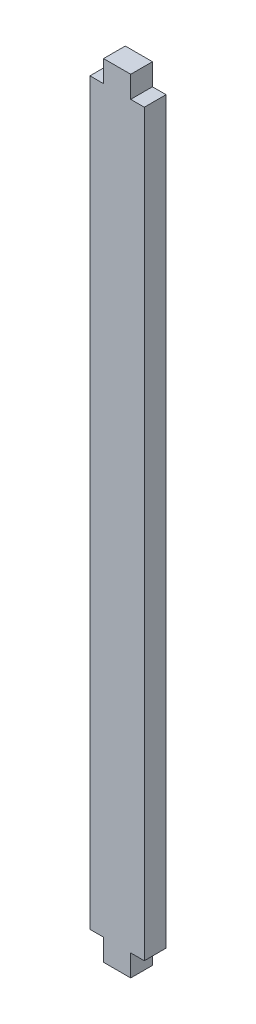
ISO-10303-21;
HEADER;
FILE_DESCRIPTION(('STEP AP214'),'2;1');
FILE_NAME('part.step','',(''),(''),'','','');
FILE_SCHEMA(('AUTOMOTIVE_DESIGN { 1 0 10303 214 1 1 1 1 }'));
ENDSEC;
DATA;
#1=APPLICATION_CONTEXT('core data for automotive mechanical design processes');
#2=APPLICATION_PROTOCOL_DEFINITION('international standard','automotive_design',2000,#1);
#3=PRODUCT_CONTEXT('',#1,'mechanical');
#4=PRODUCT('Part','Part','',(#3));
#5=PRODUCT_RELATED_PRODUCT_CATEGORY('part','',(#4));
#6=PRODUCT_DEFINITION_FORMATION('','',#4);
#7=PRODUCT_DEFINITION_CONTEXT('part definition',#1,'design');
#8=PRODUCT_DEFINITION('design','',#6,#7);
#9=PRODUCT_DEFINITION_SHAPE('','',#8);
#10=(LENGTH_UNIT() NAMED_UNIT(*) SI_UNIT(.MILLI.,.METRE.));
#11=(NAMED_UNIT(*) PLANE_ANGLE_UNIT() SI_UNIT($,.RADIAN.));
#12=(NAMED_UNIT(*) SI_UNIT($,.STERADIAN.) SOLID_ANGLE_UNIT());
#13=UNCERTAINTY_MEASURE_WITH_UNIT(LENGTH_MEASURE(1.E-05),#10,'distance_accuracy_value','');
#14=(GEOMETRIC_REPRESENTATION_CONTEXT(3) GLOBAL_UNCERTAINTY_ASSIGNED_CONTEXT((#13)) GLOBAL_UNIT_ASSIGNED_CONTEXT((#10,
#11,#12)) REPRESENTATION_CONTEXT('',''));
#15=CARTESIAN_POINT('',(0.,0.,0.));
#16=DIRECTION('',(0.,0.,1.));
#17=DIRECTION('',(1.,0.,0.));
#18=AXIS2_PLACEMENT_3D('',#15,#16,#17);
#19=CARTESIAN_POINT('',(0.,0.,5.08));
#20=DIRECTION('',(1.,0.,0.));
#21=DIRECTION('',(0.,0.,-1.));
#22=AXIS2_PLACEMENT_3D('',#19,#20,#21);
#23=PLANE('',#22);
#24=DIRECTION('',(0.,-1.,0.));
#25=VECTOR('',#24,1.);
#26=CARTESIAN_POINT('',(0.,0.,0.));
#27=LINE('',#26,#25);
#28=CARTESIAN_POINT('',(0.,177.8,0.));
#29=VERTEX_POINT('',#28);
#30=CARTESIAN_POINT('',(0.,5.08,0.));
#31=VERTEX_POINT('',#30);
#32=EDGE_CURVE('E149',#29,#31,#27,.T.);
#33=ORIENTED_EDGE('',*,*,#32,.T.);
#34=DIRECTION('',(0.,0.,1.));
#35=VECTOR('',#34,1.);
#36=CARTESIAN_POINT('',(0.,5.08,0.));
#37=LINE('',#36,#35);
#38=CARTESIAN_POINT('',(0.,5.08,5.08));
#39=VERTEX_POINT('',#38);
#40=EDGE_CURVE('E183',#31,#39,#37,.T.);
#41=ORIENTED_EDGE('',*,*,#40,.T.);
#42=DIRECTION('',(0.,-1.,0.));
#43=VECTOR('',#42,1.);
#44=CARTESIAN_POINT('',(0.,0.,5.08));
#45=LINE('',#44,#43);
#46=CARTESIAN_POINT('',(0.,177.8,5.08));
#47=VERTEX_POINT('',#46);
#48=EDGE_CURVE('E147',#47,#39,#45,.T.);
#49=ORIENTED_EDGE('',*,*,#48,.F.);
#50=DIRECTION('',(0.,0.,1.));
#51=VECTOR('',#50,1.);
#52=CARTESIAN_POINT('',(0.,177.8,0.));
#53=LINE('',#52,#51);
#54=EDGE_CURVE('E161',#29,#47,#53,.T.);
#55=ORIENTED_EDGE('',*,*,#54,.F.);
#56=EDGE_LOOP('',(#33,#41,#49,#55));
#57=FACE_BOUND('',#56,.T.);
#58=ADVANCED_FACE('F32',(#57),#23,.F.);
#59=CARTESIAN_POINT('',(0.,0.,5.08));
#60=DIRECTION('',(0.,1.,0.));
#61=DIRECTION('',(0.,0.,1.));
#62=AXIS2_PLACEMENT_3D('',#59,#60,#61);
#63=PLANE('',#62);
#64=DIRECTION('',(1.,0.,0.));
#65=VECTOR('',#64,1.);
#66=CARTESIAN_POINT('',(0.,0.,5.08));
#67=LINE('',#66,#65);
#68=CARTESIAN_POINT('',(3.175,0.,5.08));
#69=VERTEX_POINT('',#68);
#70=CARTESIAN_POINT('',(9.525,0.,5.08));
#71=VERTEX_POINT('',#70);
#72=EDGE_CURVE('E156',#69,#71,#67,.T.);
#73=ORIENTED_EDGE('',*,*,#72,.F.);
#74=DIRECTION('',(0.,0.,1.));
#75=VECTOR('',#74,1.);
#76=CARTESIAN_POINT('',(3.175,0.,0.));
#77=LINE('',#76,#75);
#78=CARTESIAN_POINT('',(3.175,0.,0.));
#79=VERTEX_POINT('',#78);
#80=EDGE_CURVE('E179',#79,#69,#77,.T.);
#81=ORIENTED_EDGE('',*,*,#80,.F.);
#82=DIRECTION('',(1.,0.,0.));
#83=VECTOR('',#82,1.);
#84=CARTESIAN_POINT('',(0.,0.,0.));
#85=LINE('',#84,#83);
#86=CARTESIAN_POINT('',(9.525,0.,0.));
#87=VERTEX_POINT('',#86);
#88=EDGE_CURVE('E145',#79,#87,#85,.T.);
#89=ORIENTED_EDGE('',*,*,#88,.T.);
#90=DIRECTION('',(0.,0.,1.));
#91=VECTOR('',#90,1.);
#92=CARTESIAN_POINT('',(9.525,0.,0.));
#93=LINE('',#92,#91);
#94=EDGE_CURVE('E193',#87,#71,#93,.T.);
#95=ORIENTED_EDGE('',*,*,#94,.T.);
#96=EDGE_LOOP('',(#73,#81,#89,#95));
#97=FACE_BOUND('',#96,.T.);
#98=ADVANCED_FACE('F220',(#97),#63,.F.);
#99=CARTESIAN_POINT('',(12.7,0.,5.08));
#100=DIRECTION('',(-1.,0.,0.));
#101=DIRECTION('',(0.,0.,1.));
#102=AXIS2_PLACEMENT_3D('',#99,#100,#101);
#103=PLANE('',#102);
#104=DIRECTION('',(0.,1.,0.));
#105=VECTOR('',#104,1.);
#106=CARTESIAN_POINT('',(12.7,0.,0.));
#107=LINE('',#106,#105);
#108=CARTESIAN_POINT('',(12.7,5.08,0.));
#109=VERTEX_POINT('',#108);
#110=CARTESIAN_POINT('',(12.7,177.8,0.));
#111=VERTEX_POINT('',#110);
#112=EDGE_CURVE('E140',#109,#111,#107,.T.);
#113=ORIENTED_EDGE('',*,*,#112,.T.);
#114=DIRECTION('',(0.,0.,1.));
#115=VECTOR('',#114,1.);
#116=CARTESIAN_POINT('',(12.7,177.8,0.));
#117=LINE('',#116,#115);
#118=CARTESIAN_POINT('',(12.7,177.8,5.08));
#119=VERTEX_POINT('',#118);
#120=EDGE_CURVE('E174',#111,#119,#117,.T.);
#121=ORIENTED_EDGE('',*,*,#120,.T.);
#122=DIRECTION('',(0.,1.,0.));
#123=VECTOR('',#122,1.);
#124=CARTESIAN_POINT('',(12.7,0.,5.08));
#125=LINE('',#124,#123);
#126=CARTESIAN_POINT('',(12.7,5.08,5.08));
#127=VERTEX_POINT('',#126);
#128=EDGE_CURVE('E40',#127,#119,#125,.T.);
#129=ORIENTED_EDGE('',*,*,#128,.F.);
#130=DIRECTION('',(0.,0.,1.));
#131=VECTOR('',#130,1.);
#132=CARTESIAN_POINT('',(12.7,5.08,0.));
#133=LINE('',#132,#131);
#134=EDGE_CURVE('E126',#109,#127,#133,.T.);
#135=ORIENTED_EDGE('',*,*,#134,.F.);
#136=EDGE_LOOP('',(#113,#121,#129,#135));
#137=FACE_BOUND('',#136,.T.);
#138=ADVANCED_FACE('F138',(#137),#103,.F.);
#139=CARTESIAN_POINT('',(0.,182.88,5.08));
#140=DIRECTION('',(0.,-1.,0.));
#141=DIRECTION('',(0.,0.,-1.));
#142=AXIS2_PLACEMENT_3D('',#139,#140,#141);
#143=PLANE('',#142);
#144=DIRECTION('',(-1.,0.,0.));
#145=VECTOR('',#144,1.);
#146=CARTESIAN_POINT('',(0.,182.88,5.08));
#147=LINE('',#146,#145);
#148=CARTESIAN_POINT('',(9.52500000000003,182.88,5.08));
#149=VERTEX_POINT('',#148);
#150=CARTESIAN_POINT('',(3.175,182.88,5.08));
#151=VERTEX_POINT('',#150);
#152=EDGE_CURVE('E11',#149,#151,#147,.T.);
#153=ORIENTED_EDGE('',*,*,#152,.F.);
#154=DIRECTION('',(0.,0.,1.));
#155=VECTOR('',#154,1.);
#156=CARTESIAN_POINT('',(9.52500000000003,182.88,0.));
#157=LINE('',#156,#155);
#158=CARTESIAN_POINT('',(9.52500000000003,182.88,0.));
#159=VERTEX_POINT('',#158);
#160=EDGE_CURVE('E197',#159,#149,#157,.T.);
#161=ORIENTED_EDGE('',*,*,#160,.F.);
#162=DIRECTION('',(-1.,0.,0.));
#163=VECTOR('',#162,1.);
#164=CARTESIAN_POINT('',(0.,182.88,0.));
#165=LINE('',#164,#163);
#166=CARTESIAN_POINT('',(3.175,182.88,0.));
#167=VERTEX_POINT('',#166);
#168=EDGE_CURVE('E35',#159,#167,#165,.T.);
#169=ORIENTED_EDGE('',*,*,#168,.T.);
#170=DIRECTION('',(0.,0.,1.));
#171=VECTOR('',#170,1.);
#172=CARTESIAN_POINT('',(3.175,182.88,0.));
#173=LINE('',#172,#171);
#174=EDGE_CURVE('E153',#167,#151,#173,.T.);
#175=ORIENTED_EDGE('',*,*,#174,.T.);
#176=EDGE_LOOP('',(#153,#161,#169,#175));
#177=FACE_BOUND('',#176,.T.);
#178=ADVANCED_FACE('F243',(#177),#143,.F.);
#179=CARTESIAN_POINT('',(0.,0.,5.08));
#180=DIRECTION('',(0.,0.,-1.));
#181=DIRECTION('',(-1.,0.,0.));
#182=AXIS2_PLACEMENT_3D('',#179,#180,#181);
#183=PLANE('',#182);
#184=ORIENTED_EDGE('',*,*,#128,.T.);
#185=DIRECTION('',(1.,0.,0.));
#186=VECTOR('',#185,1.);
#187=CARTESIAN_POINT('',(12.7,177.8,5.08));
#188=LINE('',#187,#186);
#189=CARTESIAN_POINT('',(9.52500000000003,177.8,5.08));
#190=VERTEX_POINT('',#189);
#191=EDGE_CURVE('E202',#190,#119,#188,.T.);
#192=ORIENTED_EDGE('',*,*,#191,.F.);
#193=DIRECTION('',(0.,-1.,0.));
#194=VECTOR('',#193,1.);
#195=CARTESIAN_POINT('',(9.52500000000003,182.88,5.08));
#196=LINE('',#195,#194);
#197=EDGE_CURVE('E186',#149,#190,#196,.T.);
#198=ORIENTED_EDGE('',*,*,#197,.F.);
#199=ORIENTED_EDGE('',*,*,#152,.T.);
#200=DIRECTION('',(0.,1.,0.));
#201=VECTOR('',#200,1.);
#202=CARTESIAN_POINT('',(3.175,182.88,5.08));
#203=LINE('',#202,#201);
#204=CARTESIAN_POINT('',(3.175,177.8,5.08));
#205=VERTEX_POINT('',#204);
#206=EDGE_CURVE('E168',#205,#151,#203,.T.);
#207=ORIENTED_EDGE('',*,*,#206,.F.);
#208=DIRECTION('',(1.,0.,0.));
#209=VECTOR('',#208,1.);
#210=CARTESIAN_POINT('',(0.,177.8,5.08));
#211=LINE('',#210,#209);
#212=EDGE_CURVE('E171',#47,#205,#211,.T.);
#213=ORIENTED_EDGE('',*,*,#212,.F.);
#214=ORIENTED_EDGE('',*,*,#48,.T.);
#215=DIRECTION('',(-1.,0.,0.));
#216=VECTOR('',#215,1.);
#217=CARTESIAN_POINT('',(0.,5.08,5.08));
#218=LINE('',#217,#216);
#219=CARTESIAN_POINT('',(3.175,5.08,5.08));
#220=VERTEX_POINT('',#219);
#221=EDGE_CURVE('E187',#220,#39,#218,.T.);
#222=ORIENTED_EDGE('',*,*,#221,.F.);
#223=DIRECTION('',(0.,1.,0.));
#224=VECTOR('',#223,1.);
#225=CARTESIAN_POINT('',(3.175,0.,5.08));
#226=LINE('',#225,#224);
#227=EDGE_CURVE('E190',#69,#220,#226,.T.);
#228=ORIENTED_EDGE('',*,*,#227,.F.);
#229=ORIENTED_EDGE('',*,*,#72,.T.);
#230=DIRECTION('',(0.,-1.,0.));
#231=VECTOR('',#230,1.);
#232=CARTESIAN_POINT('',(9.525,0.,5.08));
#233=LINE('',#232,#231);
#234=CARTESIAN_POINT('',(9.52500000000001,5.08,5.08));
#235=VERTEX_POINT('',#234);
#236=EDGE_CURVE('E133',#235,#71,#233,.T.);
#237=ORIENTED_EDGE('',*,*,#236,.F.);
#238=DIRECTION('',(-1.,0.,0.));
#239=VECTOR('',#238,1.);
#240=CARTESIAN_POINT('',(12.7,5.08,5.08));
#241=LINE('',#240,#239);
#242=EDGE_CURVE('E213',#127,#235,#241,.T.);
#243=ORIENTED_EDGE('',*,*,#242,.F.);
#244=EDGE_LOOP('',(#184,#192,#198,#199,#207,#213,#214,#222,#228,#229,#237,#243));
#245=FACE_BOUND('',#244,.T.);
#246=ADVANCED_FACE('F226',(#245),#183,.F.);
#247=CARTESIAN_POINT('',(0.,0.,0.));
#248=DIRECTION('',(0.,0.,-1.));
#249=DIRECTION('',(-1.,0.,0.));
#250=AXIS2_PLACEMENT_3D('',#247,#248,#249);
#251=PLANE('',#250);
#252=DIRECTION('',(1.,0.,0.));
#253=VECTOR('',#252,1.);
#254=CARTESIAN_POINT('',(12.7,177.8,0.));
#255=LINE('',#254,#253);
#256=CARTESIAN_POINT('',(9.52500000000003,177.8,0.));
#257=VERTEX_POINT('',#256);
#258=EDGE_CURVE('E48',#257,#111,#255,.T.);
#259=ORIENTED_EDGE('',*,*,#258,.T.);
#260=ORIENTED_EDGE('',*,*,#112,.F.);
#261=DIRECTION('',(-1.,0.,0.));
#262=VECTOR('',#261,1.);
#263=CARTESIAN_POINT('',(12.7,5.08,0.));
#264=LINE('',#263,#262);
#265=CARTESIAN_POINT('',(9.52500000000001,5.08,0.));
#266=VERTEX_POINT('',#265);
#267=EDGE_CURVE('E122',#109,#266,#264,.T.);
#268=ORIENTED_EDGE('',*,*,#267,.T.);
#269=DIRECTION('',(0.,-1.,0.));
#270=VECTOR('',#269,1.);
#271=CARTESIAN_POINT('',(9.525,0.,0.));
#272=LINE('',#271,#270);
#273=EDGE_CURVE('E132',#266,#87,#272,.T.);
#274=ORIENTED_EDGE('',*,*,#273,.T.);
#275=ORIENTED_EDGE('',*,*,#88,.F.);
#276=DIRECTION('',(0.,1.,0.));
#277=VECTOR('',#276,1.);
#278=CARTESIAN_POINT('',(3.175,0.,0.));
#279=LINE('',#278,#277);
#280=CARTESIAN_POINT('',(3.175,5.08,0.));
#281=VERTEX_POINT('',#280);
#282=EDGE_CURVE('E189',#79,#281,#279,.T.);
#283=ORIENTED_EDGE('',*,*,#282,.T.);
#284=DIRECTION('',(-1.,0.,0.));
#285=VECTOR('',#284,1.);
#286=CARTESIAN_POINT('',(0.,5.08,0.));
#287=LINE('',#286,#285);
#288=EDGE_CURVE('E56',#281,#31,#287,.T.);
#289=ORIENTED_EDGE('',*,*,#288,.T.);
#290=ORIENTED_EDGE('',*,*,#32,.F.);
#291=DIRECTION('',(1.,0.,0.));
#292=VECTOR('',#291,1.);
#293=CARTESIAN_POINT('',(0.,177.8,0.));
#294=LINE('',#293,#292);
#295=CARTESIAN_POINT('',(3.175,177.8,0.));
#296=VERTEX_POINT('',#295);
#297=EDGE_CURVE('E170',#29,#296,#294,.T.);
#298=ORIENTED_EDGE('',*,*,#297,.T.);
#299=DIRECTION('',(0.,1.,0.));
#300=VECTOR('',#299,1.);
#301=CARTESIAN_POINT('',(3.175,182.88,0.));
#302=LINE('',#301,#300);
#303=EDGE_CURVE('E164',#296,#167,#302,.T.);
#304=ORIENTED_EDGE('',*,*,#303,.T.);
#305=ORIENTED_EDGE('',*,*,#168,.F.);
#306=DIRECTION('',(0.,-1.,0.));
#307=VECTOR('',#306,1.);
#308=CARTESIAN_POINT('',(9.52500000000003,182.88,0.));
#309=LINE('',#308,#307);
#310=EDGE_CURVE('E204',#159,#257,#309,.T.);
#311=ORIENTED_EDGE('',*,*,#310,.T.);
#312=EDGE_LOOP('',(#259,#260,#268,#274,#275,#283,#289,#290,#298,#304,#305,#311));
#313=FACE_BOUND('',#312,.T.);
#314=ADVANCED_FACE('F143',(#313),#251,.T.);
#315=CARTESIAN_POINT('',(3.175,182.88,0.));
#316=DIRECTION('',(1.,0.,0.));
#317=DIRECTION('',(0.,1.,0.));
#318=AXIS2_PLACEMENT_3D('',#315,#316,#317);
#319=PLANE('',#318);
#320=ORIENTED_EDGE('',*,*,#206,.T.);
#321=ORIENTED_EDGE('',*,*,#174,.F.);
#322=ORIENTED_EDGE('',*,*,#303,.F.);
#323=DIRECTION('',(0.,0.,1.));
#324=VECTOR('',#323,1.);
#325=CARTESIAN_POINT('',(3.175,177.8,0.));
#326=LINE('',#325,#324);
#327=EDGE_CURVE('E163',#296,#205,#326,.T.);
#328=ORIENTED_EDGE('',*,*,#327,.T.);
#329=EDGE_LOOP('',(#320,#321,#322,#328));
#330=FACE_BOUND('',#329,.T.);
#331=ADVANCED_FACE('F240',(#330),#319,.F.);
#332=CARTESIAN_POINT('',(0.,177.8,0.));
#333=DIRECTION('',(0.,-1.,0.));
#334=DIRECTION('',(0.,0.,-1.));
#335=AXIS2_PLACEMENT_3D('',#332,#333,#334);
#336=PLANE('',#335);
#337=ORIENTED_EDGE('',*,*,#212,.T.);
#338=ORIENTED_EDGE('',*,*,#327,.F.);
#339=ORIENTED_EDGE('',*,*,#297,.F.);
#340=ORIENTED_EDGE('',*,*,#54,.T.);
#341=EDGE_LOOP('',(#337,#338,#339,#340));
#342=FACE_BOUND('',#341,.T.);
#343=ADVANCED_FACE('F237',(#342),#336,.F.);
#344=CARTESIAN_POINT('',(9.525,0.,0.));
#345=DIRECTION('',(-1.,0.,0.));
#346=DIRECTION('',(0.,-1.,0.));
#347=AXIS2_PLACEMENT_3D('',#344,#345,#346);
#348=PLANE('',#347);
#349=ORIENTED_EDGE('',*,*,#236,.T.);
#350=ORIENTED_EDGE('',*,*,#94,.F.);
#351=ORIENTED_EDGE('',*,*,#273,.F.);
#352=DIRECTION('',(0.,0.,1.));
#353=VECTOR('',#352,1.);
#354=CARTESIAN_POINT('',(9.52500000000001,5.08,0.));
#355=LINE('',#354,#353);
#356=EDGE_CURVE('E128',#266,#235,#355,.T.);
#357=ORIENTED_EDGE('',*,*,#356,.T.);
#358=EDGE_LOOP('',(#349,#350,#351,#357));
#359=FACE_BOUND('',#358,.T.);
#360=ADVANCED_FACE('F250',(#359),#348,.F.);
#361=CARTESIAN_POINT('',(12.7,5.08,0.));
#362=DIRECTION('',(0.,1.,0.));
#363=DIRECTION('',(0.,0.,1.));
#364=AXIS2_PLACEMENT_3D('',#361,#362,#363);
#365=PLANE('',#364);
#366=ORIENTED_EDGE('',*,*,#242,.T.);
#367=ORIENTED_EDGE('',*,*,#356,.F.);
#368=ORIENTED_EDGE('',*,*,#267,.F.);
#369=ORIENTED_EDGE('',*,*,#134,.T.);
#370=EDGE_LOOP('',(#366,#367,#368,#369));
#371=FACE_BOUND('',#370,.T.);
#372=ADVANCED_FACE('F125',(#371),#365,.F.);
#373=CARTESIAN_POINT('',(0.,5.08,0.));
#374=DIRECTION('',(0.,1.,0.));
#375=DIRECTION('',(0.,0.,1.));
#376=AXIS2_PLACEMENT_3D('',#373,#374,#375);
#377=PLANE('',#376);
#378=ORIENTED_EDGE('',*,*,#221,.T.);
#379=ORIENTED_EDGE('',*,*,#40,.F.);
#380=ORIENTED_EDGE('',*,*,#288,.F.);
#381=DIRECTION('',(0.,0.,1.));
#382=VECTOR('',#381,1.);
#383=CARTESIAN_POINT('',(3.175,5.08,0.));
#384=LINE('',#383,#382);
#385=EDGE_CURVE('E181',#281,#220,#384,.T.);
#386=ORIENTED_EDGE('',*,*,#385,.T.);
#387=EDGE_LOOP('',(#378,#379,#380,#386));
#388=FACE_BOUND('',#387,.T.);
#389=ADVANCED_FACE('F230',(#388),#377,.F.);
#390=CARTESIAN_POINT('',(3.175,0.,0.));
#391=DIRECTION('',(1.,0.,0.));
#392=DIRECTION('',(0.,0.,-1.));
#393=AXIS2_PLACEMENT_3D('',#390,#391,#392);
#394=PLANE('',#393);
#395=ORIENTED_EDGE('',*,*,#227,.T.);
#396=ORIENTED_EDGE('',*,*,#385,.F.);
#397=ORIENTED_EDGE('',*,*,#282,.F.);
#398=ORIENTED_EDGE('',*,*,#80,.T.);
#399=EDGE_LOOP('',(#395,#396,#397,#398));
#400=FACE_BOUND('',#399,.T.);
#401=ADVANCED_FACE('F223',(#400),#394,.F.);
#402=CARTESIAN_POINT('',(12.7,177.8,0.));
#403=DIRECTION('',(0.,-1.,0.));
#404=DIRECTION('',(0.,0.,-1.));
#405=AXIS2_PLACEMENT_3D('',#402,#403,#404);
#406=PLANE('',#405);
#407=ORIENTED_EDGE('',*,*,#191,.T.);
#408=ORIENTED_EDGE('',*,*,#120,.F.);
#409=ORIENTED_EDGE('',*,*,#258,.F.);
#410=DIRECTION('',(0.,0.,1.));
#411=VECTOR('',#410,1.);
#412=CARTESIAN_POINT('',(9.52500000000003,177.8,0.));
#413=LINE('',#412,#411);
#414=EDGE_CURVE('E199',#257,#190,#413,.T.);
#415=ORIENTED_EDGE('',*,*,#414,.T.);
#416=EDGE_LOOP('',(#407,#408,#409,#415));
#417=FACE_BOUND('',#416,.T.);
#418=ADVANCED_FACE('F249',(#417),#406,.F.);
#419=CARTESIAN_POINT('',(9.52500000000003,182.88,0.));
#420=DIRECTION('',(-1.,0.,0.));
#421=DIRECTION('',(0.,0.,1.));
#422=AXIS2_PLACEMENT_3D('',#419,#420,#421);
#423=PLANE('',#422);
#424=ORIENTED_EDGE('',*,*,#197,.T.);
#425=ORIENTED_EDGE('',*,*,#414,.F.);
#426=ORIENTED_EDGE('',*,*,#310,.F.);
#427=ORIENTED_EDGE('',*,*,#160,.T.);
#428=EDGE_LOOP('',(#424,#425,#426,#427));
#429=FACE_BOUND('',#428,.T.);
#430=ADVANCED_FACE('F248',(#429),#423,.F.);
#431=CLOSED_SHELL('',(#58,#98,#138,#178,#246,#314,#331,#343,#360,#372,#389,#401,#418,#430));
#432=MANIFOLD_SOLID_BREP('B2',#431);
#433=ADVANCED_BREP_SHAPE_REPRESENTATION('',(#18,#432),#14);
#434=SHAPE_DEFINITION_REPRESENTATION(#9,#433);
ENDSEC;
END-ISO-10303-21;
